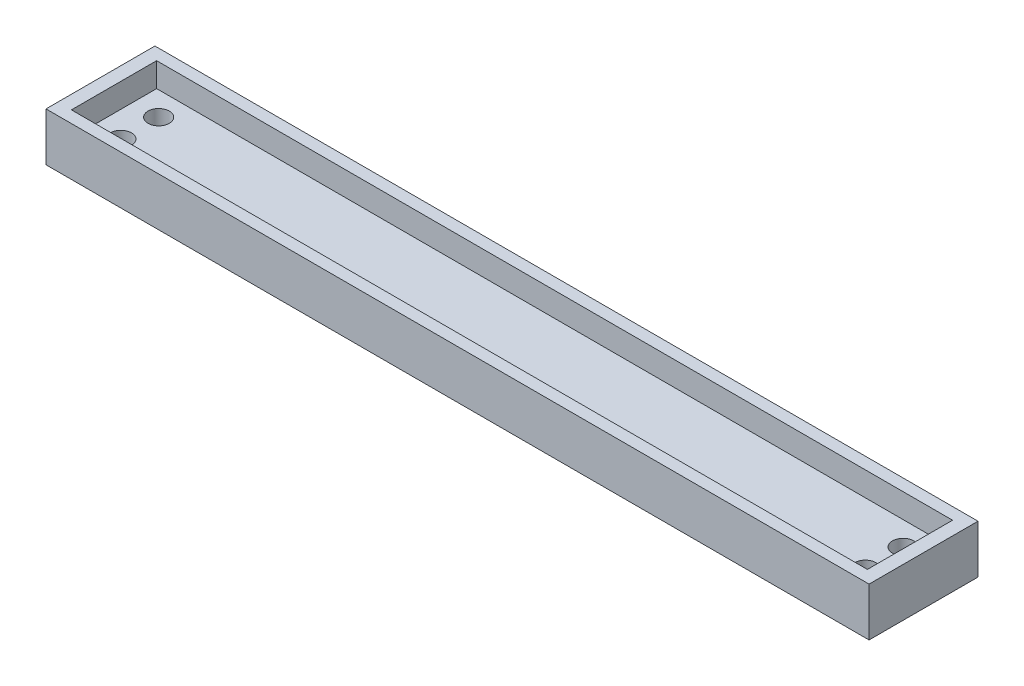
ISO-10303-21;
HEADER;
FILE_DESCRIPTION(('STEP AP214'),'2;1');
FILE_NAME('part.step','',(''),(''),'','','');
FILE_SCHEMA(('AUTOMOTIVE_DESIGN { 1 0 10303 214 1 1 1 1 }'));
ENDSEC;
DATA;
#1=APPLICATION_CONTEXT('core data for automotive mechanical design processes');
#2=APPLICATION_PROTOCOL_DEFINITION('international standard','automotive_design',2000,#1);
#3=PRODUCT_CONTEXT('',#1,'mechanical');
#4=PRODUCT('Part','Part','',(#3));
#5=PRODUCT_RELATED_PRODUCT_CATEGORY('part','',(#4));
#6=PRODUCT_DEFINITION_FORMATION('','',#4);
#7=PRODUCT_DEFINITION_CONTEXT('part definition',#1,'design');
#8=PRODUCT_DEFINITION('design','',#6,#7);
#9=PRODUCT_DEFINITION_SHAPE('','',#8);
#10=(LENGTH_UNIT() NAMED_UNIT(*) SI_UNIT(.MILLI.,.METRE.));
#11=(NAMED_UNIT(*) PLANE_ANGLE_UNIT() SI_UNIT($,.RADIAN.));
#12=(NAMED_UNIT(*) SI_UNIT($,.STERADIAN.) SOLID_ANGLE_UNIT());
#13=UNCERTAINTY_MEASURE_WITH_UNIT(LENGTH_MEASURE(1.E-05),#10,'distance_accuracy_value','');
#14=(GEOMETRIC_REPRESENTATION_CONTEXT(3) GLOBAL_UNCERTAINTY_ASSIGNED_CONTEXT((#13)) GLOBAL_UNIT_ASSIGNED_CONTEXT((#10,
#11,#12)) REPRESENTATION_CONTEXT('',''));
#15=CARTESIAN_POINT('',(0.,0.,0.));
#16=DIRECTION('',(0.,0.,1.));
#17=DIRECTION('',(1.,0.,0.));
#18=AXIS2_PLACEMENT_3D('',#15,#16,#17);
#19=CARTESIAN_POINT('',(0.,12.7,0.));
#20=DIRECTION('',(1.,0.,0.));
#21=DIRECTION('',(0.,0.,-1.));
#22=AXIS2_PLACEMENT_3D('',#19,#20,#21);
#23=PLANE('',#22);
#24=DIRECTION('',(0.,0.,1.));
#25=VECTOR('',#24,1.);
#26=CARTESIAN_POINT('',(0.,0.,0.));
#27=LINE('',#26,#25);
#28=CARTESIAN_POINT('',(0.,0.,-28.575));
#29=VERTEX_POINT('',#28);
#30=CARTESIAN_POINT('',(0.,0.,0.));
#31=VERTEX_POINT('',#30);
#32=EDGE_CURVE('E162',#29,#31,#27,.T.);
#33=ORIENTED_EDGE('',*,*,#32,.T.);
#34=DIRECTION('',(0.,-1.,0.));
#35=VECTOR('',#34,1.);
#36=CARTESIAN_POINT('',(0.,12.7,0.));
#37=LINE('',#36,#35);
#38=CARTESIAN_POINT('',(0.,12.7,0.));
#39=VERTEX_POINT('',#38);
#40=EDGE_CURVE('E11',#39,#31,#37,.T.);
#41=ORIENTED_EDGE('',*,*,#40,.F.);
#42=DIRECTION('',(0.,0.,1.));
#43=VECTOR('',#42,1.);
#44=CARTESIAN_POINT('',(0.,12.7,0.));
#45=LINE('',#44,#43);
#46=CARTESIAN_POINT('',(0.,12.7,-28.575));
#47=VERTEX_POINT('',#46);
#48=EDGE_CURVE('E168',#47,#39,#45,.T.);
#49=ORIENTED_EDGE('',*,*,#48,.F.);
#50=DIRECTION('',(0.,-1.,0.));
#51=VECTOR('',#50,1.);
#52=CARTESIAN_POINT('',(0.,12.7,-28.575));
#53=LINE('',#52,#51);
#54=EDGE_CURVE('E178',#47,#29,#53,.T.);
#55=ORIENTED_EDGE('',*,*,#54,.T.);
#56=EDGE_LOOP('',(#33,#41,#49,#55));
#57=FACE_BOUND('',#56,.T.);
#58=ADVANCED_FACE('F39',(#57),#23,.F.);
#59=CARTESIAN_POINT('',(0.,12.7,0.));
#60=DIRECTION('',(0.,0.,-1.));
#61=DIRECTION('',(-1.,0.,0.));
#62=AXIS2_PLACEMENT_3D('',#59,#60,#61);
#63=PLANE('',#62);
#64=DIRECTION('',(1.,0.,0.));
#65=VECTOR('',#64,1.);
#66=CARTESIAN_POINT('',(0.,0.,0.));
#67=LINE('',#66,#65);
#68=CARTESIAN_POINT('',(215.9,0.,0.));
#69=VERTEX_POINT('',#68);
#70=EDGE_CURVE('E182',#31,#69,#67,.T.);
#71=ORIENTED_EDGE('',*,*,#70,.T.);
#72=DIRECTION('',(0.,-1.,0.));
#73=VECTOR('',#72,1.);
#74=CARTESIAN_POINT('',(215.9,12.7,0.));
#75=LINE('',#74,#73);
#76=CARTESIAN_POINT('',(215.9,12.7,0.));
#77=VERTEX_POINT('',#76);
#78=EDGE_CURVE('E47',#77,#69,#75,.T.);
#79=ORIENTED_EDGE('',*,*,#78,.F.);
#80=DIRECTION('',(1.,0.,0.));
#81=VECTOR('',#80,1.);
#82=CARTESIAN_POINT('',(0.,12.7,0.));
#83=LINE('',#82,#81);
#84=EDGE_CURVE('E91',#39,#77,#83,.T.);
#85=ORIENTED_EDGE('',*,*,#84,.F.);
#86=ORIENTED_EDGE('',*,*,#40,.T.);
#87=EDGE_LOOP('',(#71,#79,#85,#86));
#88=FACE_BOUND('',#87,.T.);
#89=ADVANCED_FACE('F217',(#88),#63,.F.);
#90=CARTESIAN_POINT('',(215.9,12.7,0.));
#91=DIRECTION('',(-1.,0.,0.));
#92=DIRECTION('',(0.,0.,1.));
#93=AXIS2_PLACEMENT_3D('',#90,#91,#92);
#94=PLANE('',#93);
#95=DIRECTION('',(0.,0.,-1.));
#96=VECTOR('',#95,1.);
#97=CARTESIAN_POINT('',(215.9,0.,0.));
#98=LINE('',#97,#96);
#99=CARTESIAN_POINT('',(215.9,0.,-28.575));
#100=VERTEX_POINT('',#99);
#101=EDGE_CURVE('E185',#69,#100,#98,.T.);
#102=ORIENTED_EDGE('',*,*,#101,.T.);
#103=DIRECTION('',(0.,-1.,0.));
#104=VECTOR('',#103,1.);
#105=CARTESIAN_POINT('',(215.9,12.7,-28.575));
#106=LINE('',#105,#104);
#107=CARTESIAN_POINT('',(215.9,12.7,-28.575));
#108=VERTEX_POINT('',#107);
#109=EDGE_CURVE('E192',#108,#100,#106,.T.);
#110=ORIENTED_EDGE('',*,*,#109,.F.);
#111=DIRECTION('',(0.,0.,-1.));
#112=VECTOR('',#111,1.);
#113=CARTESIAN_POINT('',(215.9,12.7,0.));
#114=LINE('',#113,#112);
#115=EDGE_CURVE('E173',#77,#108,#114,.T.);
#116=ORIENTED_EDGE('',*,*,#115,.F.);
#117=ORIENTED_EDGE('',*,*,#78,.T.);
#118=EDGE_LOOP('',(#102,#110,#116,#117));
#119=FACE_BOUND('',#118,.T.);
#120=ADVANCED_FACE('F199',(#119),#94,.F.);
#121=CARTESIAN_POINT('',(0.,12.7,-28.575));
#122=DIRECTION('',(0.,0.,1.));
#123=DIRECTION('',(1.,0.,0.));
#124=AXIS2_PLACEMENT_3D('',#121,#122,#123);
#125=PLANE('',#124);
#126=DIRECTION('',(-1.,0.,0.));
#127=VECTOR('',#126,1.);
#128=CARTESIAN_POINT('',(0.,0.,-28.575));
#129=LINE('',#128,#127);
#130=EDGE_CURVE('E84',#100,#29,#129,.T.);
#131=ORIENTED_EDGE('',*,*,#130,.T.);
#132=ORIENTED_EDGE('',*,*,#54,.F.);
#133=DIRECTION('',(-1.,0.,0.));
#134=VECTOR('',#133,1.);
#135=CARTESIAN_POINT('',(0.,12.7,-28.575));
#136=LINE('',#135,#134);
#137=EDGE_CURVE('E63',#108,#47,#136,.T.);
#138=ORIENTED_EDGE('',*,*,#137,.F.);
#139=ORIENTED_EDGE('',*,*,#109,.T.);
#140=EDGE_LOOP('',(#131,#132,#138,#139));
#141=FACE_BOUND('',#140,.T.);
#142=ADVANCED_FACE('F207',(#141),#125,.F.);
#143=CARTESIAN_POINT('',(0.,12.7,0.));
#144=DIRECTION('',(0.,-1.,0.));
#145=DIRECTION('',(0.,0.,-1.));
#146=AXIS2_PLACEMENT_3D('',#143,#144,#145);
#147=PLANE('',#146);
#148=DIRECTION('',(1.,0.,0.));
#149=VECTOR('',#148,1.);
#150=CARTESIAN_POINT('',(3.556,12.7,-3.11149999999998));
#151=LINE('',#150,#149);
#152=CARTESIAN_POINT('',(3.556,12.7,-3.11149999999998));
#153=VERTEX_POINT('',#152);
#154=CARTESIAN_POINT('',(212.344,12.7,-3.11150000000001));
#155=VERTEX_POINT('',#154);
#156=EDGE_CURVE('E152',#153,#155,#151,.T.);
#157=ORIENTED_EDGE('',*,*,#156,.F.);
#158=DIRECTION('',(0.,0.,1.));
#159=VECTOR('',#158,1.);
#160=CARTESIAN_POINT('',(3.55599999999999,12.7,-25.4635));
#161=LINE('',#160,#159);
#162=CARTESIAN_POINT('',(3.55599999999999,12.7,-25.4635));
#163=VERTEX_POINT('',#162);
#164=EDGE_CURVE('E54',#163,#153,#161,.T.);
#165=ORIENTED_EDGE('',*,*,#164,.F.);
#166=DIRECTION('',(-1.,0.,0.));
#167=VECTOR('',#166,1.);
#168=CARTESIAN_POINT('',(3.55599999999999,12.7,-25.4635));
#169=LINE('',#168,#167);
#170=CARTESIAN_POINT('',(212.344,12.7,-25.4635));
#171=VERTEX_POINT('',#170);
#172=EDGE_CURVE('E136',#171,#163,#169,.T.);
#173=ORIENTED_EDGE('',*,*,#172,.F.);
#174=DIRECTION('',(0.,0.,-1.));
#175=VECTOR('',#174,1.);
#176=CARTESIAN_POINT('',(212.344,12.7,-25.4635));
#177=LINE('',#176,#175);
#178=EDGE_CURVE('E140',#155,#171,#177,.T.);
#179=ORIENTED_EDGE('',*,*,#178,.F.);
#180=EDGE_LOOP('',(#157,#165,#173,#179));
#181=FACE_BOUND('',#180,.T.);
#182=ORIENTED_EDGE('',*,*,#48,.T.);
#183=ORIENTED_EDGE('',*,*,#84,.T.);
#184=ORIENTED_EDGE('',*,*,#115,.T.);
#185=ORIENTED_EDGE('',*,*,#137,.T.);
#186=EDGE_LOOP('',(#182,#183,#184,#185));
#187=FACE_BOUND('',#186,.T.);
#188=ADVANCED_FACE('F209',(#181,#187),#147,.F.);
#189=CARTESIAN_POINT('',(0.,0.,0.));
#190=DIRECTION('',(0.,-1.,0.));
#191=DIRECTION('',(0.,0.,-1.));
#192=AXIS2_PLACEMENT_3D('',#189,#190,#191);
#193=PLANE('',#192);
#194=CARTESIAN_POINT('',(205.5876,0.,-19.2405));
#195=DIRECTION('',(0.,1.,0.));
#196=DIRECTION('',(0.,0.,-1.));
#197=AXIS2_PLACEMENT_3D('',#194,#195,#196);
#198=CIRCLE('',#197,2.79399999999998);
#199=CARTESIAN_POINT('',(205.5876,0.,-22.0345));
#200=VERTEX_POINT('',#199);
#201=EDGE_CURVE('E340',#200,#200,#198,.T.);
#202=ORIENTED_EDGE('',*,*,#201,.T.);
#203=EDGE_LOOP('',(#202));
#204=FACE_BOUND('',#203,.T.);
#205=CARTESIAN_POINT('',(205.5876,0.,-9.33450000000004));
#206=DIRECTION('',(0.,1.,0.));
#207=DIRECTION('',(0.,0.,1.));
#208=AXIS2_PLACEMENT_3D('',#205,#206,#207);
#209=CIRCLE('',#208,2.79400000000001);
#210=CARTESIAN_POINT('',(205.5876,0.,-6.54050000000003));
#211=VERTEX_POINT('',#210);
#212=EDGE_CURVE('E367',#211,#211,#209,.T.);
#213=ORIENTED_EDGE('',*,*,#212,.T.);
#214=EDGE_LOOP('',(#213));
#215=FACE_BOUND('',#214,.T.);
#216=CARTESIAN_POINT('',(10.3124,0.,-9.33450000000002));
#217=DIRECTION('',(0.,1.,0.));
#218=DIRECTION('',(0.,0.,-1.));
#219=AXIS2_PLACEMENT_3D('',#216,#217,#218);
#220=CIRCLE('',#219,2.794);
#221=CARTESIAN_POINT('',(10.3124,0.,-12.1285));
#222=VERTEX_POINT('',#221);
#223=EDGE_CURVE('E356',#222,#222,#220,.T.);
#224=ORIENTED_EDGE('',*,*,#223,.T.);
#225=EDGE_LOOP('',(#224));
#226=FACE_BOUND('',#225,.T.);
#227=CARTESIAN_POINT('',(10.3124,0.,-19.2405));
#228=DIRECTION('',(0.,1.,0.));
#229=DIRECTION('',(0.,0.,1.));
#230=AXIS2_PLACEMENT_3D('',#227,#228,#229);
#231=CIRCLE('',#230,2.794);
#232=CARTESIAN_POINT('',(10.3124,0.,-16.4465));
#233=VERTEX_POINT('',#232);
#234=EDGE_CURVE('E153',#233,#233,#231,.T.);
#235=ORIENTED_EDGE('',*,*,#234,.T.);
#236=EDGE_LOOP('',(#235));
#237=FACE_BOUND('',#236,.T.);
#238=ORIENTED_EDGE('',*,*,#32,.F.);
#239=ORIENTED_EDGE('',*,*,#130,.F.);
#240=ORIENTED_EDGE('',*,*,#101,.F.);
#241=ORIENTED_EDGE('',*,*,#70,.F.);
#242=EDGE_LOOP('',(#238,#239,#240,#241));
#243=FACE_BOUND('',#242,.T.);
#244=ADVANCED_FACE('F203',(#204,#215,#226,#237,#243),#193,.T.);
#245=CARTESIAN_POINT('',(3.55599999999999,6.35,-25.4635));
#246=DIRECTION('',(-1.,0.,0.));
#247=DIRECTION('',(0.,0.,1.));
#248=AXIS2_PLACEMENT_3D('',#245,#246,#247);
#249=PLANE('',#248);
#250=ORIENTED_EDGE('',*,*,#164,.T.);
#251=DIRECTION('',(0.,1.,0.));
#252=VECTOR('',#251,1.);
#253=CARTESIAN_POINT('',(3.556,6.35,-3.11149999999998));
#254=LINE('',#253,#252);
#255=CARTESIAN_POINT('',(3.556,6.35,-3.11149999999998));
#256=VERTEX_POINT('',#255);
#257=EDGE_CURVE('E111',#256,#153,#254,.T.);
#258=ORIENTED_EDGE('',*,*,#257,.F.);
#259=DIRECTION('',(0.,0.,1.));
#260=VECTOR('',#259,1.);
#261=CARTESIAN_POINT('',(3.55599999999999,6.35,-25.4635));
#262=LINE('',#261,#260);
#263=CARTESIAN_POINT('',(3.55599999999999,6.35,-25.4635));
#264=VERTEX_POINT('',#263);
#265=EDGE_CURVE('E115',#264,#256,#262,.T.);
#266=ORIENTED_EDGE('',*,*,#265,.F.);
#267=DIRECTION('',(0.,1.,0.));
#268=VECTOR('',#267,1.);
#269=CARTESIAN_POINT('',(3.55599999999999,6.35,-25.4635));
#270=LINE('',#269,#268);
#271=EDGE_CURVE('E159',#264,#163,#270,.T.);
#272=ORIENTED_EDGE('',*,*,#271,.T.);
#273=EDGE_LOOP('',(#250,#258,#266,#272));
#274=FACE_BOUND('',#273,.T.);
#275=ADVANCED_FACE('F113',(#274),#249,.F.);
#276=CARTESIAN_POINT('',(3.55599999999999,6.35,-25.4635));
#277=DIRECTION('',(0.,0.,-1.));
#278=DIRECTION('',(-1.,0.,0.));
#279=AXIS2_PLACEMENT_3D('',#276,#277,#278);
#280=PLANE('',#279);
#281=ORIENTED_EDGE('',*,*,#172,.T.);
#282=ORIENTED_EDGE('',*,*,#271,.F.);
#283=DIRECTION('',(-1.,0.,0.));
#284=VECTOR('',#283,1.);
#285=CARTESIAN_POINT('',(3.55599999999999,6.35,-25.4635));
#286=LINE('',#285,#284);
#287=CARTESIAN_POINT('',(212.344,6.35,-25.4635));
#288=VERTEX_POINT('',#287);
#289=EDGE_CURVE('E122',#288,#264,#286,.T.);
#290=ORIENTED_EDGE('',*,*,#289,.F.);
#291=DIRECTION('',(0.,1.,0.));
#292=VECTOR('',#291,1.);
#293=CARTESIAN_POINT('',(212.344,6.35,-25.4635));
#294=LINE('',#293,#292);
#295=EDGE_CURVE('E163',#288,#171,#294,.T.);
#296=ORIENTED_EDGE('',*,*,#295,.T.);
#297=EDGE_LOOP('',(#281,#282,#290,#296));
#298=FACE_BOUND('',#297,.T.);
#299=ADVANCED_FACE('F251',(#298),#280,.F.);
#300=CARTESIAN_POINT('',(212.344,6.35,-25.4635));
#301=DIRECTION('',(1.,0.,0.));
#302=DIRECTION('',(0.,0.,-1.));
#303=AXIS2_PLACEMENT_3D('',#300,#301,#302);
#304=PLANE('',#303);
#305=ORIENTED_EDGE('',*,*,#178,.T.);
#306=ORIENTED_EDGE('',*,*,#295,.F.);
#307=DIRECTION('',(0.,0.,-1.));
#308=VECTOR('',#307,1.);
#309=CARTESIAN_POINT('',(212.344,6.35,-25.4635));
#310=LINE('',#309,#308);
#311=CARTESIAN_POINT('',(212.344,6.35,-3.11150000000001));
#312=VERTEX_POINT('',#311);
#313=EDGE_CURVE('E131',#312,#288,#310,.T.);
#314=ORIENTED_EDGE('',*,*,#313,.F.);
#315=DIRECTION('',(0.,1.,0.));
#316=VECTOR('',#315,1.);
#317=CARTESIAN_POINT('',(212.344,6.35,-3.11150000000001));
#318=LINE('',#317,#316);
#319=EDGE_CURVE('E121',#312,#155,#318,.T.);
#320=ORIENTED_EDGE('',*,*,#319,.T.);
#321=EDGE_LOOP('',(#305,#306,#314,#320));
#322=FACE_BOUND('',#321,.T.);
#323=ADVANCED_FACE('F260',(#322),#304,.F.);
#324=CARTESIAN_POINT('',(3.556,6.35,-3.11149999999998));
#325=DIRECTION('',(0.,0.,1.));
#326=DIRECTION('',(1.,0.,0.));
#327=AXIS2_PLACEMENT_3D('',#324,#325,#326);
#328=PLANE('',#327);
#329=ORIENTED_EDGE('',*,*,#156,.T.);
#330=ORIENTED_EDGE('',*,*,#319,.F.);
#331=DIRECTION('',(1.,0.,0.));
#332=VECTOR('',#331,1.);
#333=CARTESIAN_POINT('',(3.556,6.35,-3.11149999999998));
#334=LINE('',#333,#332);
#335=EDGE_CURVE('E125',#256,#312,#334,.T.);
#336=ORIENTED_EDGE('',*,*,#335,.F.);
#337=ORIENTED_EDGE('',*,*,#257,.T.);
#338=EDGE_LOOP('',(#329,#330,#336,#337));
#339=FACE_BOUND('',#338,.T.);
#340=ADVANCED_FACE('F126',(#339),#328,.F.);
#341=CARTESIAN_POINT('',(0.,6.35,0.));
#342=DIRECTION('',(0.,1.,0.));
#343=DIRECTION('',(0.,0.,1.));
#344=AXIS2_PLACEMENT_3D('',#341,#342,#343);
#345=PLANE('',#344);
#346=CARTESIAN_POINT('',(205.5876,6.35,-19.2405));
#347=DIRECTION('',(0.,1.,0.));
#348=DIRECTION('',(0.,0.,-1.));
#349=AXIS2_PLACEMENT_3D('',#346,#347,#348);
#350=CIRCLE('',#349,2.79399999999998);
#351=CARTESIAN_POINT('',(205.5876,6.35,-22.0345));
#352=VERTEX_POINT('',#351);
#353=EDGE_CURVE('E343',#352,#352,#350,.T.);
#354=ORIENTED_EDGE('',*,*,#353,.F.);
#355=EDGE_LOOP('',(#354));
#356=FACE_BOUND('',#355,.T.);
#357=CARTESIAN_POINT('',(205.5876,6.35,-9.33450000000004));
#358=DIRECTION('',(0.,1.,0.));
#359=DIRECTION('',(0.,0.,1.));
#360=AXIS2_PLACEMENT_3D('',#357,#358,#359);
#361=CIRCLE('',#360,2.79400000000001);
#362=CARTESIAN_POINT('',(205.5876,6.35,-6.54050000000003));
#363=VERTEX_POINT('',#362);
#364=EDGE_CURVE('E347',#363,#363,#361,.T.);
#365=ORIENTED_EDGE('',*,*,#364,.F.);
#366=EDGE_LOOP('',(#365));
#367=FACE_BOUND('',#366,.T.);
#368=CARTESIAN_POINT('',(10.3124,6.35,-9.33450000000002));
#369=DIRECTION('',(0.,1.,0.));
#370=DIRECTION('',(0.,0.,-1.));
#371=AXIS2_PLACEMENT_3D('',#368,#369,#370);
#372=CIRCLE('',#371,2.794);
#373=CARTESIAN_POINT('',(10.3124,6.35,-12.1285));
#374=VERTEX_POINT('',#373);
#375=EDGE_CURVE('E361',#374,#374,#372,.T.);
#376=ORIENTED_EDGE('',*,*,#375,.F.);
#377=EDGE_LOOP('',(#376));
#378=FACE_BOUND('',#377,.T.);
#379=CARTESIAN_POINT('',(10.3124,6.35,-19.2405));
#380=DIRECTION('',(0.,1.,0.));
#381=DIRECTION('',(0.,0.,1.));
#382=AXIS2_PLACEMENT_3D('',#379,#380,#381);
#383=CIRCLE('',#382,2.794);
#384=CARTESIAN_POINT('',(10.3124,6.35,-16.4465));
#385=VERTEX_POINT('',#384);
#386=EDGE_CURVE('E143',#385,#385,#383,.T.);
#387=ORIENTED_EDGE('',*,*,#386,.F.);
#388=EDGE_LOOP('',(#387));
#389=FACE_BOUND('',#388,.T.);
#390=ORIENTED_EDGE('',*,*,#265,.T.);
#391=ORIENTED_EDGE('',*,*,#335,.T.);
#392=ORIENTED_EDGE('',*,*,#313,.T.);
#393=ORIENTED_EDGE('',*,*,#289,.T.);
#394=EDGE_LOOP('',(#390,#391,#392,#393));
#395=FACE_BOUND('',#394,.T.);
#396=ADVANCED_FACE('F133',(#356,#367,#378,#389,#395),#345,.T.);
#397=CARTESIAN_POINT('',(10.3124,0.,-19.2405));
#398=DIRECTION('',(0.,1.,0.));
#399=DIRECTION('',(0.,0.,1.));
#400=AXIS2_PLACEMENT_3D('',#397,#398,#399);
#401=CYLINDRICAL_SURFACE('',#400,2.794);
#402=ORIENTED_EDGE('',*,*,#234,.F.);
#403=EDGE_LOOP('',(#402));
#404=FACE_BOUND('',#403,.T.);
#405=ORIENTED_EDGE('',*,*,#386,.T.);
#406=EDGE_LOOP('',(#405));
#407=FACE_BOUND('',#406,.T.);
#408=ADVANCED_FACE('F293',(#404,#407),#401,.F.);
#409=CARTESIAN_POINT('',(10.3124,0.,-9.33450000000002));
#410=DIRECTION('',(0.,1.,0.));
#411=DIRECTION('',(0.,0.,1.));
#412=AXIS2_PLACEMENT_3D('',#409,#410,#411);
#413=CYLINDRICAL_SURFACE('',#412,2.794);
#414=ORIENTED_EDGE('',*,*,#223,.F.);
#415=EDGE_LOOP('',(#414));
#416=FACE_BOUND('',#415,.T.);
#417=ORIENTED_EDGE('',*,*,#375,.T.);
#418=EDGE_LOOP('',(#417));
#419=FACE_BOUND('',#418,.T.);
#420=ADVANCED_FACE('F303',(#416,#419),#413,.F.);
#421=CARTESIAN_POINT('',(205.5876,0.,-9.33450000000004));
#422=DIRECTION('',(0.,1.,0.));
#423=DIRECTION('',(0.,0.,1.));
#424=AXIS2_PLACEMENT_3D('',#421,#422,#423);
#425=CYLINDRICAL_SURFACE('',#424,2.79400000000001);
#426=ORIENTED_EDGE('',*,*,#212,.F.);
#427=EDGE_LOOP('',(#426));
#428=FACE_BOUND('',#427,.T.);
#429=ORIENTED_EDGE('',*,*,#364,.T.);
#430=EDGE_LOOP('',(#429));
#431=FACE_BOUND('',#430,.T.);
#432=ADVANCED_FACE('F313',(#428,#431),#425,.F.);
#433=CARTESIAN_POINT('',(205.5876,0.,-19.2405));
#434=DIRECTION('',(0.,1.,0.));
#435=DIRECTION('',(0.,0.,1.));
#436=AXIS2_PLACEMENT_3D('',#433,#434,#435);
#437=CYLINDRICAL_SURFACE('',#436,2.79399999999998);
#438=ORIENTED_EDGE('',*,*,#201,.F.);
#439=EDGE_LOOP('',(#438));
#440=FACE_BOUND('',#439,.T.);
#441=ORIENTED_EDGE('',*,*,#353,.T.);
#442=EDGE_LOOP('',(#441));
#443=FACE_BOUND('',#442,.T.);
#444=ADVANCED_FACE('F323',(#440,#443),#437,.F.);
#445=CLOSED_SHELL('',(#58,#89,#120,#142,#188,#244,#275,#299,#323,#340,#396,#408,#420,#432,#444));
#446=MANIFOLD_SOLID_BREP('B2',#445);
#447=ADVANCED_BREP_SHAPE_REPRESENTATION('',(#18,#446),#14);
#448=SHAPE_DEFINITION_REPRESENTATION(#9,#447);
ENDSEC;
END-ISO-10303-21;
